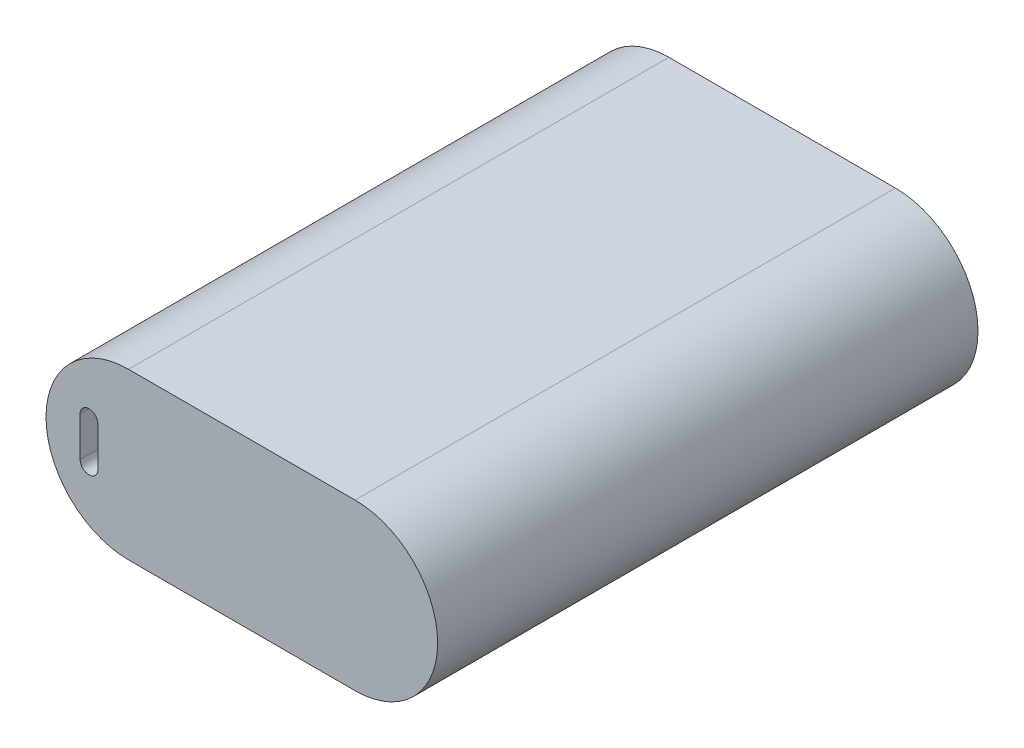
ISO-10303-21;
HEADER;
FILE_DESCRIPTION(('STEP AP214'),'2;1');
FILE_NAME('part.step','',(''),(''),'','','');
FILE_SCHEMA(('AUTOMOTIVE_DESIGN { 1 0 10303 214 1 1 1 1 }'));
ENDSEC;
DATA;
#1=APPLICATION_CONTEXT('core data for automotive mechanical design processes');
#2=APPLICATION_PROTOCOL_DEFINITION('international standard','automotive_design',2000,#1);
#3=PRODUCT_CONTEXT('',#1,'mechanical');
#4=PRODUCT('Part','Part','',(#3));
#5=PRODUCT_RELATED_PRODUCT_CATEGORY('part','',(#4));
#6=PRODUCT_DEFINITION_FORMATION('','',#4);
#7=PRODUCT_DEFINITION_CONTEXT('part definition',#1,'design');
#8=PRODUCT_DEFINITION('design','',#6,#7);
#9=PRODUCT_DEFINITION_SHAPE('','',#8);
#10=(LENGTH_UNIT() NAMED_UNIT(*) SI_UNIT(.MILLI.,.METRE.));
#11=(NAMED_UNIT(*) PLANE_ANGLE_UNIT() SI_UNIT($,.RADIAN.));
#12=(NAMED_UNIT(*) SI_UNIT($,.STERADIAN.) SOLID_ANGLE_UNIT());
#13=UNCERTAINTY_MEASURE_WITH_UNIT(LENGTH_MEASURE(1.E-05),#10,'distance_accuracy_value','');
#14=(GEOMETRIC_REPRESENTATION_CONTEXT(3) GLOBAL_UNCERTAINTY_ASSIGNED_CONTEXT((#13)) GLOBAL_UNIT_ASSIGNED_CONTEXT((#10,
#11,#12)) REPRESENTATION_CONTEXT('',''));
#15=CARTESIAN_POINT('',(0.,0.,0.));
#16=DIRECTION('',(0.,0.,1.));
#17=DIRECTION('',(1.,0.,0.));
#18=AXIS2_PLACEMENT_3D('',#15,#16,#17);
#19=CARTESIAN_POINT('',(0.,12.1,79.2));
#20=DIRECTION('',(0.,0.,-1.));
#21=DIRECTION('',(-1.,0.,0.));
#22=AXIS2_PLACEMENT_3D('',#19,#20,#21);
#23=CYLINDRICAL_SURFACE('',#22,12.1);
#24=CARTESIAN_POINT('',(0.,12.1,0.));
#25=DIRECTION('',(0.,0.,1.));
#26=DIRECTION('',(1.,0.,0.));
#27=AXIS2_PLACEMENT_3D('',#24,#25,#26);
#28=CIRCLE('',#27,12.1);
#29=CARTESIAN_POINT('',(0.,24.2,0.));
#30=VERTEX_POINT('',#29);
#31=CARTESIAN_POINT('',(0.,0.,0.));
#32=VERTEX_POINT('',#31);
#33=EDGE_CURVE('E190',#30,#32,#28,.T.);
#34=ORIENTED_EDGE('',*,*,#33,.T.);
#35=DIRECTION('',(0.,0.,-1.));
#36=VECTOR('',#35,1.);
#37=CARTESIAN_POINT('',(0.,0.,79.2));
#38=LINE('',#37,#36);
#39=CARTESIAN_POINT('',(0.,0.,79.2));
#40=VERTEX_POINT('',#39);
#41=EDGE_CURVE('E11',#40,#32,#38,.T.);
#42=ORIENTED_EDGE('',*,*,#41,.F.);
#43=CARTESIAN_POINT('',(0.,12.1,79.2));
#44=DIRECTION('',(0.,0.,1.));
#45=DIRECTION('',(1.,0.,0.));
#46=AXIS2_PLACEMENT_3D('',#43,#44,#45);
#47=CIRCLE('',#46,12.1);
#48=CARTESIAN_POINT('',(0.,24.2,79.2));
#49=VERTEX_POINT('',#48);
#50=EDGE_CURVE('E196',#49,#40,#47,.T.);
#51=ORIENTED_EDGE('',*,*,#50,.F.);
#52=DIRECTION('',(0.,0.,-1.));
#53=VECTOR('',#52,1.);
#54=CARTESIAN_POINT('',(0.,24.2,79.2));
#55=LINE('',#54,#53);
#56=EDGE_CURVE('E206',#49,#30,#55,.T.);
#57=ORIENTED_EDGE('',*,*,#56,.T.);
#58=EDGE_LOOP('',(#34,#42,#51,#57));
#59=FACE_BOUND('',#58,.T.);
#60=ADVANCED_FACE('F39',(#59),#23,.T.);
#61=CARTESIAN_POINT('',(0.,0.,79.2));
#62=DIRECTION('',(0.,1.,0.));
#63=DIRECTION('',(0.,0.,1.));
#64=AXIS2_PLACEMENT_3D('',#61,#62,#63);
#65=PLANE('',#64);
#66=DIRECTION('',(1.,0.,0.));
#67=VECTOR('',#66,1.);
#68=CARTESIAN_POINT('',(0.,0.,0.));
#69=LINE('',#68,#67);
#70=CARTESIAN_POINT('',(33.2,0.,0.));
#71=VERTEX_POINT('',#70);
#72=EDGE_CURVE('E209',#32,#71,#69,.T.);
#73=ORIENTED_EDGE('',*,*,#72,.T.);
#74=DIRECTION('',(0.,0.,-1.));
#75=VECTOR('',#74,1.);
#76=CARTESIAN_POINT('',(33.2,0.,79.2));
#77=LINE('',#76,#75);
#78=CARTESIAN_POINT('',(33.2,0.,79.2));
#79=VERTEX_POINT('',#78);
#80=EDGE_CURVE('E46',#79,#71,#77,.T.);
#81=ORIENTED_EDGE('',*,*,#80,.F.);
#82=DIRECTION('',(1.,0.,0.));
#83=VECTOR('',#82,1.);
#84=CARTESIAN_POINT('',(0.,0.,79.2));
#85=LINE('',#84,#83);
#86=EDGE_CURVE('E199',#40,#79,#85,.T.);
#87=ORIENTED_EDGE('',*,*,#86,.F.);
#88=ORIENTED_EDGE('',*,*,#41,.T.);
#89=EDGE_LOOP('',(#73,#81,#87,#88));
#90=FACE_BOUND('',#89,.T.);
#91=ADVANCED_FACE('F239',(#90),#65,.F.);
#92=CARTESIAN_POINT('',(33.2,12.1,79.2));
#93=DIRECTION('',(0.,0.,-1.));
#94=DIRECTION('',(-1.,0.,0.));
#95=AXIS2_PLACEMENT_3D('',#92,#93,#94);
#96=CYLINDRICAL_SURFACE('',#95,12.1);
#97=CARTESIAN_POINT('',(33.2,12.1,0.));
#98=DIRECTION('',(0.,0.,1.));
#99=DIRECTION('',(1.,0.,0.));
#100=AXIS2_PLACEMENT_3D('',#97,#98,#99);
#101=CIRCLE('',#100,12.1);
#102=CARTESIAN_POINT('',(33.2,24.2,0.));
#103=VERTEX_POINT('',#102);
#104=EDGE_CURVE('E211',#71,#103,#101,.T.);
#105=ORIENTED_EDGE('',*,*,#104,.T.);
#106=DIRECTION('',(0.,0.,-1.));
#107=VECTOR('',#106,1.);
#108=CARTESIAN_POINT('',(33.2,24.2,79.2));
#109=LINE('',#108,#107);
#110=CARTESIAN_POINT('',(33.2,24.2,79.2));
#111=VERTEX_POINT('',#110);
#112=EDGE_CURVE('E216',#111,#103,#109,.T.);
#113=ORIENTED_EDGE('',*,*,#112,.F.);
#114=CARTESIAN_POINT('',(33.2,12.1,79.2));
#115=DIRECTION('',(0.,0.,1.));
#116=DIRECTION('',(1.,0.,0.));
#117=AXIS2_PLACEMENT_3D('',#114,#115,#116);
#118=CIRCLE('',#117,12.1);
#119=EDGE_CURVE('E202',#79,#111,#118,.T.);
#120=ORIENTED_EDGE('',*,*,#119,.F.);
#121=ORIENTED_EDGE('',*,*,#80,.T.);
#122=EDGE_LOOP('',(#105,#113,#120,#121));
#123=FACE_BOUND('',#122,.T.);
#124=ADVANCED_FACE('F223',(#123),#96,.T.);
#125=CARTESIAN_POINT('',(0.,24.2,79.2));
#126=DIRECTION('',(0.,-1.,0.));
#127=DIRECTION('',(0.,0.,-1.));
#128=AXIS2_PLACEMENT_3D('',#125,#126,#127);
#129=PLANE('',#128);
#130=DIRECTION('',(-1.,0.,0.));
#131=VECTOR('',#130,1.);
#132=CARTESIAN_POINT('',(0.,24.2,0.));
#133=LINE('',#132,#131);
#134=EDGE_CURVE('E200',#103,#30,#133,.T.);
#135=ORIENTED_EDGE('',*,*,#134,.T.);
#136=ORIENTED_EDGE('',*,*,#56,.F.);
#137=DIRECTION('',(-1.,0.,0.));
#138=VECTOR('',#137,1.);
#139=CARTESIAN_POINT('',(0.,24.2,79.2));
#140=LINE('',#139,#138);
#141=EDGE_CURVE('E204',#111,#49,#140,.T.);
#142=ORIENTED_EDGE('',*,*,#141,.F.);
#143=ORIENTED_EDGE('',*,*,#112,.T.);
#144=EDGE_LOOP('',(#135,#136,#142,#143));
#145=FACE_BOUND('',#144,.T.);
#146=ADVANCED_FACE('F232',(#145),#129,.F.);
#147=CARTESIAN_POINT('',(0.,12.1,79.2));
#148=DIRECTION('',(0.,0.,1.));
#149=DIRECTION('',(1.,0.,0.));
#150=AXIS2_PLACEMENT_3D('',#147,#148,#149);
#151=PLANE('',#150);
#152=CARTESIAN_POINT('',(-5.8,9.19999999999999,79.2));
#153=DIRECTION('',(0.,0.,1.));
#154=DIRECTION('',(1.,0.,0.));
#155=AXIS2_PLACEMENT_3D('',#152,#153,#154);
#156=CIRCLE('',#155,1.3);
#157=CARTESIAN_POINT('',(-7.1,9.19999999999999,79.2));
#158=VERTEX_POINT('',#157);
#159=CARTESIAN_POINT('',(-4.5,9.19999999999999,79.2));
#160=VERTEX_POINT('',#159);
#161=EDGE_CURVE('E53',#158,#160,#156,.T.);
#162=ORIENTED_EDGE('',*,*,#161,.F.);
#163=DIRECTION('',(0.,-1.,0.));
#164=VECTOR('',#163,1.);
#165=CARTESIAN_POINT('',(-7.1,9.19999999999999,79.2));
#166=LINE('',#165,#164);
#167=CARTESIAN_POINT('',(-7.1,15.,79.2));
#168=VERTEX_POINT('',#167);
#169=EDGE_CURVE('E147',#168,#158,#166,.T.);
#170=ORIENTED_EDGE('',*,*,#169,.F.);
#171=CARTESIAN_POINT('',(-5.8,15.,79.2));
#172=DIRECTION('',(0.,0.,1.));
#173=DIRECTION('',(1.,0.,0.));
#174=AXIS2_PLACEMENT_3D('',#171,#172,#173);
#175=CIRCLE('',#174,1.3);
#176=CARTESIAN_POINT('',(-4.5,15.,79.2));
#177=VERTEX_POINT('',#176);
#178=EDGE_CURVE('E150',#177,#168,#175,.T.);
#179=ORIENTED_EDGE('',*,*,#178,.F.);
#180=DIRECTION('',(0.,1.,0.));
#181=VECTOR('',#180,1.);
#182=CARTESIAN_POINT('',(-4.5,9.19999999999999,79.2));
#183=LINE('',#182,#181);
#184=EDGE_CURVE('E156',#160,#177,#183,.T.);
#185=ORIENTED_EDGE('',*,*,#184,.F.);
#186=EDGE_LOOP('',(#162,#170,#179,#185));
#187=FACE_BOUND('',#186,.T.);
#188=ORIENTED_EDGE('',*,*,#50,.T.);
#189=ORIENTED_EDGE('',*,*,#86,.T.);
#190=ORIENTED_EDGE('',*,*,#119,.T.);
#191=ORIENTED_EDGE('',*,*,#141,.T.);
#192=EDGE_LOOP('',(#188,#189,#190,#191));
#193=FACE_BOUND('',#192,.T.);
#194=ADVANCED_FACE('F238',(#187,#193),#151,.T.);
#195=CARTESIAN_POINT('',(0.,12.1,0.));
#196=DIRECTION('',(0.,0.,1.));
#197=DIRECTION('',(1.,0.,0.));
#198=AXIS2_PLACEMENT_3D('',#195,#196,#197);
#199=PLANE('',#198);
#200=DIRECTION('',(1.,0.,0.));
#201=VECTOR('',#200,1.);
#202=CARTESIAN_POINT('',(-7.69999999999999,18.6,0.));
#203=LINE('',#202,#201);
#204=CARTESIAN_POINT('',(-7.69999999999999,18.6,0.));
#205=VERTEX_POINT('',#204);
#206=CARTESIAN_POINT('',(-2.6,18.6,0.));
#207=VERTEX_POINT('',#206);
#208=EDGE_CURVE('E180',#205,#207,#203,.T.);
#209=ORIENTED_EDGE('',*,*,#208,.F.);
#210=DIRECTION('',(0.,1.,0.));
#211=VECTOR('',#210,1.);
#212=CARTESIAN_POINT('',(-7.69999999999999,18.6,0.));
#213=LINE('',#212,#211);
#214=CARTESIAN_POINT('',(-7.7,5.6,0.));
#215=VERTEX_POINT('',#214);
#216=EDGE_CURVE('E61',#215,#205,#213,.T.);
#217=ORIENTED_EDGE('',*,*,#216,.F.);
#218=DIRECTION('',(-1.,0.,0.));
#219=VECTOR('',#218,1.);
#220=CARTESIAN_POINT('',(-7.7,5.6,0.));
#221=LINE('',#220,#219);
#222=CARTESIAN_POINT('',(-2.6,5.6,0.));
#223=VERTEX_POINT('',#222);
#224=EDGE_CURVE('E169',#223,#215,#221,.T.);
#225=ORIENTED_EDGE('',*,*,#224,.F.);
#226=DIRECTION('',(0.,-1.,0.));
#227=VECTOR('',#226,1.);
#228=CARTESIAN_POINT('',(-2.6,18.6,0.));
#229=LINE('',#228,#227);
#230=EDGE_CURVE('E183',#207,#223,#229,.T.);
#231=ORIENTED_EDGE('',*,*,#230,.F.);
#232=EDGE_LOOP('',(#209,#217,#225,#231));
#233=FACE_BOUND('',#232,.T.);
#234=ORIENTED_EDGE('',*,*,#33,.F.);
#235=ORIENTED_EDGE('',*,*,#134,.F.);
#236=ORIENTED_EDGE('',*,*,#104,.F.);
#237=ORIENTED_EDGE('',*,*,#72,.F.);
#238=EDGE_LOOP('',(#234,#235,#236,#237));
#239=FACE_BOUND('',#238,.T.);
#240=ADVANCED_FACE('F229',(#233,#239),#199,.F.);
#241=CARTESIAN_POINT('',(-7.69999999999999,18.6,10.));
#242=DIRECTION('',(-1.,0.,0.));
#243=DIRECTION('',(0.,-1.,0.));
#244=AXIS2_PLACEMENT_3D('',#241,#242,#243);
#245=PLANE('',#244);
#246=ORIENTED_EDGE('',*,*,#216,.T.);
#247=DIRECTION('',(0.,0.,-1.));
#248=VECTOR('',#247,1.);
#249=CARTESIAN_POINT('',(-7.69999999999999,18.6,10.));
#250=LINE('',#249,#248);
#251=CARTESIAN_POINT('',(-7.69999999999999,18.6,10.));
#252=VERTEX_POINT('',#251);
#253=EDGE_CURVE('E178',#252,#205,#250,.T.);
#254=ORIENTED_EDGE('',*,*,#253,.F.);
#255=DIRECTION('',(0.,1.,0.));
#256=VECTOR('',#255,1.);
#257=CARTESIAN_POINT('',(-7.69999999999999,18.6,10.));
#258=LINE('',#257,#256);
#259=CARTESIAN_POINT('',(-7.7,5.6,10.));
#260=VERTEX_POINT('',#259);
#261=EDGE_CURVE('E165',#260,#252,#258,.T.);
#262=ORIENTED_EDGE('',*,*,#261,.F.);
#263=DIRECTION('',(0.,0.,-1.));
#264=VECTOR('',#263,1.);
#265=CARTESIAN_POINT('',(-7.7,5.6,10.));
#266=LINE('',#265,#264);
#267=EDGE_CURVE('E188',#260,#215,#266,.T.);
#268=ORIENTED_EDGE('',*,*,#267,.T.);
#269=EDGE_LOOP('',(#246,#254,#262,#268));
#270=FACE_BOUND('',#269,.T.);
#271=ADVANCED_FACE('F251',(#270),#245,.F.);
#272=CARTESIAN_POINT('',(-7.7,5.6,10.));
#273=DIRECTION('',(0.,-1.,0.));
#274=DIRECTION('',(1.,0.,0.));
#275=AXIS2_PLACEMENT_3D('',#272,#273,#274);
#276=PLANE('',#275);
#277=ORIENTED_EDGE('',*,*,#224,.T.);
#278=ORIENTED_EDGE('',*,*,#267,.F.);
#279=DIRECTION('',(-1.,0.,0.));
#280=VECTOR('',#279,1.);
#281=CARTESIAN_POINT('',(-7.7,5.6,10.));
#282=LINE('',#281,#280);
#283=CARTESIAN_POINT('',(-2.6,5.6,10.));
#284=VERTEX_POINT('',#283);
#285=EDGE_CURVE('E175',#284,#260,#282,.T.);
#286=ORIENTED_EDGE('',*,*,#285,.F.);
#287=DIRECTION('',(0.,0.,-1.));
#288=VECTOR('',#287,1.);
#289=CARTESIAN_POINT('',(-2.6,5.6,10.));
#290=LINE('',#289,#288);
#291=EDGE_CURVE('E191',#284,#223,#290,.T.);
#292=ORIENTED_EDGE('',*,*,#291,.T.);
#293=EDGE_LOOP('',(#277,#278,#286,#292));
#294=FACE_BOUND('',#293,.T.);
#295=ADVANCED_FACE('F258',(#294),#276,.F.);
#296=CARTESIAN_POINT('',(-2.6,18.6,10.));
#297=DIRECTION('',(1.,0.,0.));
#298=DIRECTION('',(0.,1.,0.));
#299=AXIS2_PLACEMENT_3D('',#296,#297,#298);
#300=PLANE('',#299);
#301=ORIENTED_EDGE('',*,*,#230,.T.);
#302=ORIENTED_EDGE('',*,*,#291,.F.);
#303=DIRECTION('',(0.,-1.,0.));
#304=VECTOR('',#303,1.);
#305=CARTESIAN_POINT('',(-2.6,18.6,10.));
#306=LINE('',#305,#304);
#307=CARTESIAN_POINT('',(-2.6,18.6,10.));
#308=VERTEX_POINT('',#307);
#309=EDGE_CURVE('E172',#308,#284,#306,.T.);
#310=ORIENTED_EDGE('',*,*,#309,.F.);
#311=DIRECTION('',(0.,0.,-1.));
#312=VECTOR('',#311,1.);
#313=CARTESIAN_POINT('',(-2.6,18.6,10.));
#314=LINE('',#313,#312);
#315=EDGE_CURVE('E193',#308,#207,#314,.T.);
#316=ORIENTED_EDGE('',*,*,#315,.T.);
#317=EDGE_LOOP('',(#301,#302,#310,#316));
#318=FACE_BOUND('',#317,.T.);
#319=ADVANCED_FACE('F263',(#318),#300,.F.);
#320=CARTESIAN_POINT('',(-7.69999999999999,18.6,10.));
#321=DIRECTION('',(0.,1.,0.));
#322=DIRECTION('',(-1.,0.,0.));
#323=AXIS2_PLACEMENT_3D('',#320,#321,#322);
#324=PLANE('',#323);
#325=ORIENTED_EDGE('',*,*,#208,.T.);
#326=ORIENTED_EDGE('',*,*,#315,.F.);
#327=DIRECTION('',(1.,0.,0.));
#328=VECTOR('',#327,1.);
#329=CARTESIAN_POINT('',(-7.69999999999999,18.6,10.));
#330=LINE('',#329,#328);
#331=EDGE_CURVE('E168',#252,#308,#330,.T.);
#332=ORIENTED_EDGE('',*,*,#331,.F.);
#333=ORIENTED_EDGE('',*,*,#253,.T.);
#334=EDGE_LOOP('',(#325,#326,#332,#333));
#335=FACE_BOUND('',#334,.T.);
#336=ADVANCED_FACE('F259',(#335),#324,.F.);
#337=CARTESIAN_POINT('',(0.,0.,10.));
#338=DIRECTION('',(0.,0.,1.));
#339=DIRECTION('',(1.,0.,0.));
#340=AXIS2_PLACEMENT_3D('',#337,#338,#339);
#341=PLANE('',#340);
#342=ORIENTED_EDGE('',*,*,#261,.T.);
#343=ORIENTED_EDGE('',*,*,#331,.T.);
#344=ORIENTED_EDGE('',*,*,#309,.T.);
#345=ORIENTED_EDGE('',*,*,#285,.T.);
#346=EDGE_LOOP('',(#342,#343,#344,#345));
#347=FACE_BOUND('',#346,.T.);
#348=ADVANCED_FACE('F262',(#347),#341,.F.);
#349=CARTESIAN_POINT('',(-5.8,9.19999999999999,72.55));
#350=DIRECTION('',(0.,0.,1.));
#351=DIRECTION('',(1.,0.,0.));
#352=AXIS2_PLACEMENT_3D('',#349,#350,#351);
#353=CYLINDRICAL_SURFACE('',#352,1.3);
#354=ORIENTED_EDGE('',*,*,#161,.T.);
#355=DIRECTION('',(0.,0.,1.));
#356=VECTOR('',#355,1.);
#357=CARTESIAN_POINT('',(-4.5,9.19999999999999,72.55));
#358=LINE('',#357,#356);
#359=CARTESIAN_POINT('',(-4.5,9.19999999999999,72.55));
#360=VERTEX_POINT('',#359);
#361=EDGE_CURVE('E125',#360,#160,#358,.T.);
#362=ORIENTED_EDGE('',*,*,#361,.F.);
#363=CARTESIAN_POINT('',(-5.8,9.19999999999999,72.55));
#364=DIRECTION('',(0.,0.,1.));
#365=DIRECTION('',(1.,0.,0.));
#366=AXIS2_PLACEMENT_3D('',#363,#364,#365);
#367=CIRCLE('',#366,1.3);
#368=CARTESIAN_POINT('',(-7.1,9.19999999999999,72.55));
#369=VERTEX_POINT('',#368);
#370=EDGE_CURVE('E129',#369,#360,#367,.T.);
#371=ORIENTED_EDGE('',*,*,#370,.F.);
#372=DIRECTION('',(0.,0.,1.));
#373=VECTOR('',#372,1.);
#374=CARTESIAN_POINT('',(-7.1,9.19999999999999,72.55));
#375=LINE('',#374,#373);
#376=EDGE_CURVE('E160',#369,#158,#375,.T.);
#377=ORIENTED_EDGE('',*,*,#376,.T.);
#378=EDGE_LOOP('',(#354,#362,#371,#377));
#379=FACE_BOUND('',#378,.T.);
#380=ADVANCED_FACE('F127',(#379),#353,.F.);
#381=CARTESIAN_POINT('',(-7.1,9.19999999999999,72.55));
#382=DIRECTION('',(-1.,0.,0.));
#383=DIRECTION('',(0.,-1.,0.));
#384=AXIS2_PLACEMENT_3D('',#381,#382,#383);
#385=PLANE('',#384);
#386=ORIENTED_EDGE('',*,*,#169,.T.);
#387=ORIENTED_EDGE('',*,*,#376,.F.);
#388=DIRECTION('',(0.,-1.,0.));
#389=VECTOR('',#388,1.);
#390=CARTESIAN_POINT('',(-7.1,9.19999999999999,72.55));
#391=LINE('',#390,#389);
#392=CARTESIAN_POINT('',(-7.1,15.,72.55));
#393=VERTEX_POINT('',#392);
#394=EDGE_CURVE('E135',#393,#369,#391,.T.);
#395=ORIENTED_EDGE('',*,*,#394,.F.);
#396=DIRECTION('',(0.,0.,1.));
#397=VECTOR('',#396,1.);
#398=CARTESIAN_POINT('',(-7.1,15.,72.55));
#399=LINE('',#398,#397);
#400=EDGE_CURVE('E162',#393,#168,#399,.T.);
#401=ORIENTED_EDGE('',*,*,#400,.T.);
#402=EDGE_LOOP('',(#386,#387,#395,#401));
#403=FACE_BOUND('',#402,.T.);
#404=ADVANCED_FACE('F276',(#403),#385,.F.);
#405=CARTESIAN_POINT('',(-5.8,15.,72.55));
#406=DIRECTION('',(0.,0.,1.));
#407=DIRECTION('',(1.,0.,0.));
#408=AXIS2_PLACEMENT_3D('',#405,#406,#407);
#409=CYLINDRICAL_SURFACE('',#408,1.3);
#410=ORIENTED_EDGE('',*,*,#178,.T.);
#411=ORIENTED_EDGE('',*,*,#400,.F.);
#412=CARTESIAN_POINT('',(-5.8,15.,72.55));
#413=DIRECTION('',(0.,0.,1.));
#414=DIRECTION('',(1.,0.,0.));
#415=AXIS2_PLACEMENT_3D('',#412,#413,#414);
#416=CIRCLE('',#415,1.3);
#417=CARTESIAN_POINT('',(-4.5,15.,72.55));
#418=VERTEX_POINT('',#417);
#419=EDGE_CURVE('E143',#418,#393,#416,.T.);
#420=ORIENTED_EDGE('',*,*,#419,.F.);
#421=DIRECTION('',(0.,0.,1.));
#422=VECTOR('',#421,1.);
#423=CARTESIAN_POINT('',(-4.5,15.,72.55));
#424=LINE('',#423,#422);
#425=EDGE_CURVE('E134',#418,#177,#424,.T.);
#426=ORIENTED_EDGE('',*,*,#425,.T.);
#427=EDGE_LOOP('',(#410,#411,#420,#426));
#428=FACE_BOUND('',#427,.T.);
#429=ADVANCED_FACE('F279',(#428),#409,.F.);
#430=CARTESIAN_POINT('',(-4.5,9.19999999999999,72.55));
#431=DIRECTION('',(1.,0.,0.));
#432=DIRECTION('',(0.,1.,0.));
#433=AXIS2_PLACEMENT_3D('',#430,#431,#432);
#434=PLANE('',#433);
#435=ORIENTED_EDGE('',*,*,#184,.T.);
#436=ORIENTED_EDGE('',*,*,#425,.F.);
#437=DIRECTION('',(0.,1.,0.));
#438=VECTOR('',#437,1.);
#439=CARTESIAN_POINT('',(-4.5,9.19999999999999,72.55));
#440=LINE('',#439,#438);
#441=EDGE_CURVE('E138',#360,#418,#440,.T.);
#442=ORIENTED_EDGE('',*,*,#441,.F.);
#443=ORIENTED_EDGE('',*,*,#361,.T.);
#444=EDGE_LOOP('',(#435,#436,#442,#443));
#445=FACE_BOUND('',#444,.T.);
#446=ADVANCED_FACE('F139',(#445),#434,.F.);
#447=CARTESIAN_POINT('',(-5.8,9.19999999999999,72.55));
#448=DIRECTION('',(0.,0.,1.));
#449=DIRECTION('',(1.,0.,0.));
#450=AXIS2_PLACEMENT_3D('',#447,#448,#449);
#451=PLANE('',#450);
#452=ORIENTED_EDGE('',*,*,#370,.T.);
#453=ORIENTED_EDGE('',*,*,#441,.T.);
#454=ORIENTED_EDGE('',*,*,#419,.T.);
#455=ORIENTED_EDGE('',*,*,#394,.T.);
#456=EDGE_LOOP('',(#452,#453,#454,#455));
#457=FACE_BOUND('',#456,.T.);
#458=ADVANCED_FACE('F145',(#457),#451,.T.);
#459=CLOSED_SHELL('',(#60,#91,#124,#146,#194,#240,#271,#295,#319,#336,#348,#380,#404,#429,#446,#458));
#460=MANIFOLD_SOLID_BREP('B2',#459);
#461=ADVANCED_BREP_SHAPE_REPRESENTATION('',(#18,#460),#14);
#462=SHAPE_DEFINITION_REPRESENTATION(#9,#461);
ENDSEC;
END-ISO-10303-21;
